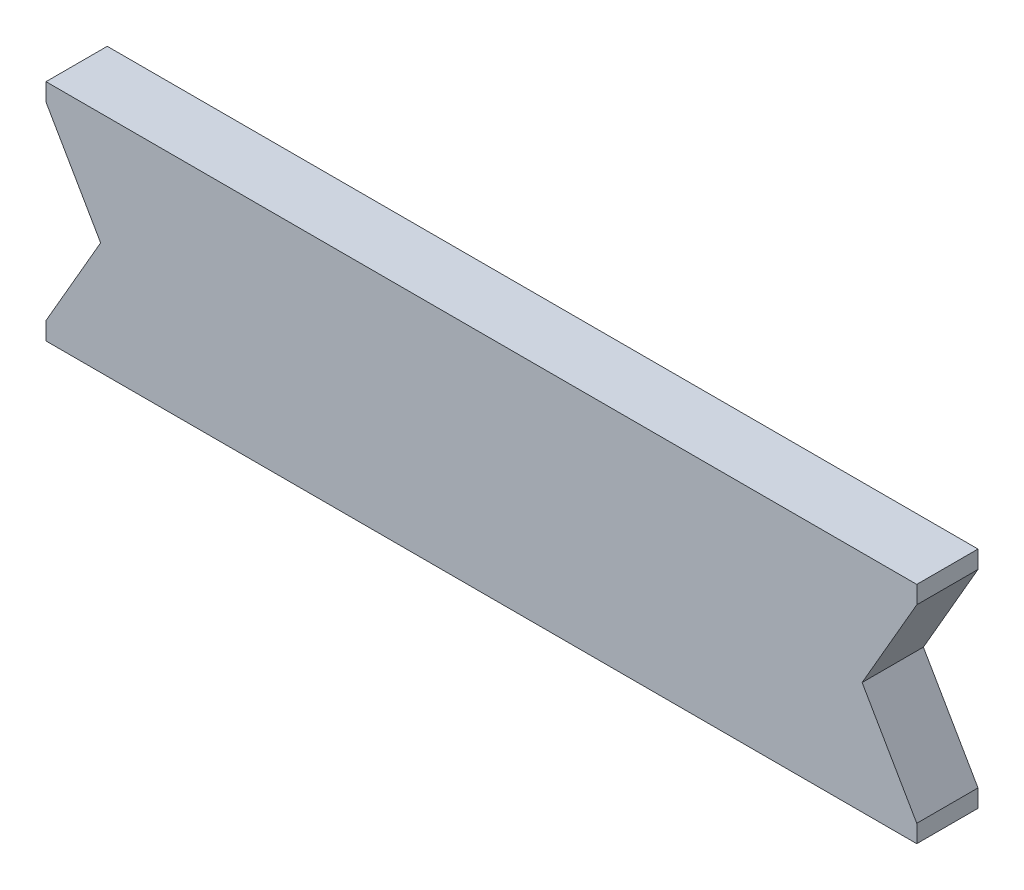
ISO-10303-21;
HEADER;
FILE_DESCRIPTION(('STEP AP214'),'2;1');
FILE_NAME('part.step','',(''),(''),'','','');
FILE_SCHEMA(('AUTOMOTIVE_DESIGN { 1 0 10303 214 1 1 1 1 }'));
ENDSEC;
DATA;
#1=APPLICATION_CONTEXT('core data for automotive mechanical design processes');
#2=APPLICATION_PROTOCOL_DEFINITION('international standard','automotive_design',2000,#1);
#3=PRODUCT_CONTEXT('',#1,'mechanical');
#4=PRODUCT('Part','Part','',(#3));
#5=PRODUCT_RELATED_PRODUCT_CATEGORY('part','',(#4));
#6=PRODUCT_DEFINITION_FORMATION('','',#4);
#7=PRODUCT_DEFINITION_CONTEXT('part definition',#1,'design');
#8=PRODUCT_DEFINITION('design','',#6,#7);
#9=PRODUCT_DEFINITION_SHAPE('','',#8);
#10=(LENGTH_UNIT() NAMED_UNIT(*) SI_UNIT(.MILLI.,.METRE.));
#11=(NAMED_UNIT(*) PLANE_ANGLE_UNIT() SI_UNIT($,.RADIAN.));
#12=(NAMED_UNIT(*) SI_UNIT($,.STERADIAN.) SOLID_ANGLE_UNIT());
#13=UNCERTAINTY_MEASURE_WITH_UNIT(LENGTH_MEASURE(1.E-05),#10,'distance_accuracy_value','');
#14=(GEOMETRIC_REPRESENTATION_CONTEXT(3) GLOBAL_UNCERTAINTY_ASSIGNED_CONTEXT((#13)) GLOBAL_UNIT_ASSIGNED_CONTEXT((#10,
#11,#12)) REPRESENTATION_CONTEXT('',''));
#15=CARTESIAN_POINT('',(0.,0.,0.));
#16=DIRECTION('',(0.,0.,1.));
#17=DIRECTION('',(1.,0.,0.));
#18=AXIS2_PLACEMENT_3D('',#15,#16,#17);
#19=CARTESIAN_POINT('',(10.9122867597285,2.75,1.5));
#20=DIRECTION('',(0.,-1.,0.));
#21=DIRECTION('',(0.,0.,-1.));
#22=AXIS2_PLACEMENT_3D('',#19,#20,#21);
#23=PLANE('',#22);
#24=DIRECTION('',(-1.,0.,0.));
#25=VECTOR('',#24,1.);
#26=CARTESIAN_POINT('',(10.9122867597285,2.75,0.));
#27=LINE('',#26,#25);
#28=CARTESIAN_POINT('',(10.6622867597285,2.75,0.));
#29=VERTEX_POINT('',#28);
#30=CARTESIAN_POINT('',(-10.6622867597285,2.75,0.));
#31=VERTEX_POINT('',#30);
#32=EDGE_CURVE('E156',#29,#31,#27,.T.);
#33=ORIENTED_EDGE('',*,*,#32,.T.);
#34=DIRECTION('',(0.,0.,1.));
#35=VECTOR('',#34,1.);
#36=CARTESIAN_POINT('',(-10.6622867597285,2.75,0.));
#37=LINE('',#36,#35);
#38=CARTESIAN_POINT('',(-10.6622867597285,2.75,1.5));
#39=VERTEX_POINT('',#38);
#40=EDGE_CURVE('E54',#31,#39,#37,.T.);
#41=ORIENTED_EDGE('',*,*,#40,.T.);
#42=DIRECTION('',(-1.,0.,0.));
#43=VECTOR('',#42,1.);
#44=CARTESIAN_POINT('',(10.9122867597285,2.75,1.5));
#45=LINE('',#44,#43);
#46=CARTESIAN_POINT('',(10.6622867597285,2.75,1.5));
#47=VERTEX_POINT('',#46);
#48=EDGE_CURVE('E137',#47,#39,#45,.T.);
#49=ORIENTED_EDGE('',*,*,#48,.F.);
#50=DIRECTION('',(0.,0.,1.));
#51=VECTOR('',#50,1.);
#52=CARTESIAN_POINT('',(10.6622867597285,2.75,0.));
#53=LINE('',#52,#51);
#54=EDGE_CURVE('E176',#29,#47,#53,.T.);
#55=ORIENTED_EDGE('',*,*,#54,.F.);
#56=EDGE_LOOP('',(#33,#41,#49,#55));
#57=FACE_BOUND('',#56,.T.);
#58=ADVANCED_FACE('F32',(#57),#23,.F.);
#59=CARTESIAN_POINT('',(-10.9122867597285,2.75,1.5));
#60=DIRECTION('',(0.866025403784439,0.5,0.));
#61=DIRECTION('',(-0.5,0.866025403784439,0.));
#62=AXIS2_PLACEMENT_3D('',#59,#60,#61);
#63=PLANE('',#62);
#64=DIRECTION('',(0.5,-0.866025403784439,0.));
#65=VECTOR('',#64,1.);
#66=CARTESIAN_POINT('',(-10.9122867597285,2.75,1.5));
#67=LINE('',#66,#65);
#68=CARTESIAN_POINT('',(-10.6622867597285,2.31698729810778,1.5));
#69=VERTEX_POINT('',#68);
#70=CARTESIAN_POINT('',(-9.32457351945707,0.,1.5));
#71=VERTEX_POINT('',#70);
#72=EDGE_CURVE('E166',#69,#71,#67,.T.);
#73=ORIENTED_EDGE('',*,*,#72,.F.);
#74=DIRECTION('',(0.,0.,-1.));
#75=VECTOR('',#74,1.);
#76=CARTESIAN_POINT('',(-10.6622867597285,2.31698729810778,1.5));
#77=LINE('',#76,#75);
#78=CARTESIAN_POINT('',(-10.6622867597285,2.31698729810778,0.));
#79=VERTEX_POINT('',#78);
#80=EDGE_CURVE('E185',#69,#79,#77,.T.);
#81=ORIENTED_EDGE('',*,*,#80,.T.);
#82=DIRECTION('',(0.5,-0.866025403784439,0.));
#83=VECTOR('',#82,1.);
#84=CARTESIAN_POINT('',(-10.9122867597285,2.75,0.));
#85=LINE('',#84,#83);
#86=CARTESIAN_POINT('',(-9.32457351945707,0.,0.));
#87=VERTEX_POINT('',#86);
#88=EDGE_CURVE('E131',#79,#87,#85,.T.);
#89=ORIENTED_EDGE('',*,*,#88,.T.);
#90=DIRECTION('',(0.,0.,-1.));
#91=VECTOR('',#90,1.);
#92=CARTESIAN_POINT('',(-9.32457351945707,0.,1.5));
#93=LINE('',#92,#91);
#94=EDGE_CURVE('E141',#71,#87,#93,.T.);
#95=ORIENTED_EDGE('',*,*,#94,.F.);
#96=EDGE_LOOP('',(#73,#81,#89,#95));
#97=FACE_BOUND('',#96,.T.);
#98=ADVANCED_FACE('F212',(#97),#63,.F.);
#99=CARTESIAN_POINT('',(-9.32457351945707,0.,1.5));
#100=DIRECTION('',(0.866025403784439,-0.5,0.));
#101=DIRECTION('',(0.5,0.866025403784439,0.));
#102=AXIS2_PLACEMENT_3D('',#99,#100,#101);
#103=PLANE('',#102);
#104=DIRECTION('',(-0.5,-0.866025403784439,0.));
#105=VECTOR('',#104,1.);
#106=CARTESIAN_POINT('',(-9.32457351945707,0.,0.));
#107=LINE('',#106,#105);
#108=CARTESIAN_POINT('',(-10.6622867597285,-2.31698729810777,0.));
#109=VERTEX_POINT('',#108);
#110=EDGE_CURVE('E127',#87,#109,#107,.T.);
#111=ORIENTED_EDGE('',*,*,#110,.T.);
#112=DIRECTION('',(0.,0.,1.));
#113=VECTOR('',#112,1.);
#114=CARTESIAN_POINT('',(-10.6622867597285,-2.31698729810777,1.5));
#115=LINE('',#114,#113);
#116=CARTESIAN_POINT('',(-10.6622867597285,-2.31698729810777,1.5));
#117=VERTEX_POINT('',#116);
#118=EDGE_CURVE('E46',#109,#117,#115,.T.);
#119=ORIENTED_EDGE('',*,*,#118,.T.);
#120=DIRECTION('',(-0.5,-0.866025403784439,0.));
#121=VECTOR('',#120,1.);
#122=CARTESIAN_POINT('',(-9.32457351945707,0.,1.5));
#123=LINE('',#122,#121);
#124=EDGE_CURVE('E149',#71,#117,#123,.T.);
#125=ORIENTED_EDGE('',*,*,#124,.F.);
#126=ORIENTED_EDGE('',*,*,#94,.T.);
#127=EDGE_LOOP('',(#111,#119,#125,#126));
#128=FACE_BOUND('',#127,.T.);
#129=ADVANCED_FACE('F147',(#128),#103,.F.);
#130=CARTESIAN_POINT('',(-10.9122867597285,-2.74999999999999,1.5));
#131=DIRECTION('',(0.,1.,0.));
#132=DIRECTION('',(0.,0.,1.));
#133=AXIS2_PLACEMENT_3D('',#130,#131,#132);
#134=PLANE('',#133);
#135=DIRECTION('',(1.,0.,0.));
#136=VECTOR('',#135,1.);
#137=CARTESIAN_POINT('',(-10.9122867597285,-2.74999999999999,1.5));
#138=LINE('',#137,#136);
#139=CARTESIAN_POINT('',(-10.6622867597285,-2.74999999999999,1.5));
#140=VERTEX_POINT('',#139);
#141=CARTESIAN_POINT('',(10.6622867597285,-2.74999999999999,1.5));
#142=VERTEX_POINT('',#141);
#143=EDGE_CURVE('E121',#140,#142,#138,.T.);
#144=ORIENTED_EDGE('',*,*,#143,.F.);
#145=DIRECTION('',(0.,0.,1.));
#146=VECTOR('',#145,1.);
#147=CARTESIAN_POINT('',(-10.6622867597285,-2.74999999999999,0.));
#148=LINE('',#147,#146);
#149=CARTESIAN_POINT('',(-10.6622867597285,-2.74999999999999,0.));
#150=VERTEX_POINT('',#149);
#151=EDGE_CURVE('E107',#150,#140,#148,.T.);
#152=ORIENTED_EDGE('',*,*,#151,.F.);
#153=DIRECTION('',(1.,0.,0.));
#154=VECTOR('',#153,1.);
#155=CARTESIAN_POINT('',(-10.9122867597285,-2.74999999999999,0.));
#156=LINE('',#155,#154);
#157=CARTESIAN_POINT('',(10.6622867597285,-2.74999999999999,0.));
#158=VERTEX_POINT('',#157);
#159=EDGE_CURVE('E119',#150,#158,#156,.T.);
#160=ORIENTED_EDGE('',*,*,#159,.T.);
#161=DIRECTION('',(0.,0.,1.));
#162=VECTOR('',#161,1.);
#163=CARTESIAN_POINT('',(10.6622867597285,-2.74999999999999,0.));
#164=LINE('',#163,#162);
#165=EDGE_CURVE('E175',#158,#142,#164,.T.);
#166=ORIENTED_EDGE('',*,*,#165,.T.);
#167=EDGE_LOOP('',(#144,#152,#160,#166));
#168=FACE_BOUND('',#167,.T.);
#169=ADVANCED_FACE('F117',(#168),#134,.F.);
#170=CARTESIAN_POINT('',(10.9122867597285,-2.74999999999999,1.5));
#171=DIRECTION('',(-0.866025403784439,-0.5,0.));
#172=DIRECTION('',(0.5,-0.866025403784439,0.));
#173=AXIS2_PLACEMENT_3D('',#170,#171,#172);
#174=PLANE('',#173);
#175=DIRECTION('',(-0.5,0.866025403784439,0.));
#176=VECTOR('',#175,1.);
#177=CARTESIAN_POINT('',(10.9122867597285,-2.74999999999999,1.5));
#178=LINE('',#177,#176);
#179=CARTESIAN_POINT('',(10.6622867597285,-2.31698729810777,1.5));
#180=VERTEX_POINT('',#179);
#181=CARTESIAN_POINT('',(9.32457351945707,0.,1.5));
#182=VERTEX_POINT('',#181);
#183=EDGE_CURVE('E162',#180,#182,#178,.T.);
#184=ORIENTED_EDGE('',*,*,#183,.F.);
#185=DIRECTION('',(0.,0.,-1.));
#186=VECTOR('',#185,1.);
#187=CARTESIAN_POINT('',(10.6622867597285,-2.31698729810777,1.5));
#188=LINE('',#187,#186);
#189=CARTESIAN_POINT('',(10.6622867597285,-2.31698729810777,0.));
#190=VERTEX_POINT('',#189);
#191=EDGE_CURVE('E157',#180,#190,#188,.T.);
#192=ORIENTED_EDGE('',*,*,#191,.T.);
#193=DIRECTION('',(-0.5,0.866025403784439,0.));
#194=VECTOR('',#193,1.);
#195=CARTESIAN_POINT('',(10.9122867597285,-2.74999999999999,0.));
#196=LINE('',#195,#194);
#197=CARTESIAN_POINT('',(9.32457351945707,0.,0.));
#198=VERTEX_POINT('',#197);
#199=EDGE_CURVE('E126',#190,#198,#196,.T.);
#200=ORIENTED_EDGE('',*,*,#199,.T.);
#201=DIRECTION('',(0.,0.,-1.));
#202=VECTOR('',#201,1.);
#203=CARTESIAN_POINT('',(9.32457351945707,0.,1.5));
#204=LINE('',#203,#202);
#205=EDGE_CURVE('E138',#182,#198,#204,.T.);
#206=ORIENTED_EDGE('',*,*,#205,.F.);
#207=EDGE_LOOP('',(#184,#192,#200,#206));
#208=FACE_BOUND('',#207,.T.);
#209=ADVANCED_FACE('F207',(#208),#174,.F.);
#210=CARTESIAN_POINT('',(9.32457351945707,0.,1.5));
#211=DIRECTION('',(-0.866025403784439,0.5,0.));
#212=DIRECTION('',(-0.5,-0.866025403784439,0.));
#213=AXIS2_PLACEMENT_3D('',#210,#211,#212);
#214=PLANE('',#213);
#215=DIRECTION('',(0.5,0.866025403784439,0.));
#216=VECTOR('',#215,1.);
#217=CARTESIAN_POINT('',(9.32457351945707,0.,0.));
#218=LINE('',#217,#216);
#219=CARTESIAN_POINT('',(10.6622867597285,2.31698729810778,0.));
#220=VERTEX_POINT('',#219);
#221=EDGE_CURVE('E129',#198,#220,#218,.T.);
#222=ORIENTED_EDGE('',*,*,#221,.T.);
#223=DIRECTION('',(0.,0.,1.));
#224=VECTOR('',#223,1.);
#225=CARTESIAN_POINT('',(10.6622867597285,2.31698729810778,1.5));
#226=LINE('',#225,#224);
#227=CARTESIAN_POINT('',(10.6622867597285,2.31698729810778,1.5));
#228=VERTEX_POINT('',#227);
#229=EDGE_CURVE('E172',#220,#228,#226,.T.);
#230=ORIENTED_EDGE('',*,*,#229,.T.);
#231=DIRECTION('',(0.5,0.866025403784439,0.));
#232=VECTOR('',#231,1.);
#233=CARTESIAN_POINT('',(9.32457351945707,0.,1.5));
#234=LINE('',#233,#232);
#235=EDGE_CURVE('E142',#182,#228,#234,.T.);
#236=ORIENTED_EDGE('',*,*,#235,.F.);
#237=ORIENTED_EDGE('',*,*,#205,.T.);
#238=EDGE_LOOP('',(#222,#230,#236,#237));
#239=FACE_BOUND('',#238,.T.);
#240=ADVANCED_FACE('F202',(#239),#214,.F.);
#241=CARTESIAN_POINT('',(0.,0.,1.5));
#242=DIRECTION('',(0.,0.,1.));
#243=DIRECTION('',(1.,0.,0.));
#244=AXIS2_PLACEMENT_3D('',#241,#242,#243);
#245=PLANE('',#244);
#246=DIRECTION('',(0.,1.,0.));
#247=VECTOR('',#246,1.);
#248=CARTESIAN_POINT('',(-10.6622867597285,2.75,1.5));
#249=LINE('',#248,#247);
#250=EDGE_CURVE('E113',#140,#117,#249,.T.);
#251=ORIENTED_EDGE('',*,*,#250,.F.);
#252=ORIENTED_EDGE('',*,*,#143,.T.);
#253=DIRECTION('',(0.,-1.,0.));
#254=VECTOR('',#253,1.);
#255=CARTESIAN_POINT('',(10.6622867597285,2.75,1.5));
#256=LINE('',#255,#254);
#257=EDGE_CURVE('E182',#180,#142,#256,.T.);
#258=ORIENTED_EDGE('',*,*,#257,.F.);
#259=ORIENTED_EDGE('',*,*,#183,.T.);
#260=ORIENTED_EDGE('',*,*,#235,.T.);
#261=EDGE_CURVE('E180',#47,#228,#256,.T.);
#262=ORIENTED_EDGE('',*,*,#261,.F.);
#263=ORIENTED_EDGE('',*,*,#48,.T.);
#264=EDGE_CURVE('E189',#69,#39,#249,.T.);
#265=ORIENTED_EDGE('',*,*,#264,.F.);
#266=ORIENTED_EDGE('',*,*,#72,.T.);
#267=ORIENTED_EDGE('',*,*,#124,.T.);
#268=EDGE_LOOP('',(#251,#252,#258,#259,#260,#262,#263,#265,#266,#267));
#269=FACE_BOUND('',#268,.T.);
#270=ADVANCED_FACE('F197',(#269),#245,.T.);
#271=CARTESIAN_POINT('',(0.,0.,0.));
#272=DIRECTION('',(0.,0.,1.));
#273=DIRECTION('',(1.,0.,0.));
#274=AXIS2_PLACEMENT_3D('',#271,#272,#273);
#275=PLANE('',#274);
#276=ORIENTED_EDGE('',*,*,#159,.F.);
#277=DIRECTION('',(0.,1.,0.));
#278=VECTOR('',#277,1.);
#279=CARTESIAN_POINT('',(-10.6622867597285,2.75,0.));
#280=LINE('',#279,#278);
#281=EDGE_CURVE('E104',#150,#109,#280,.T.);
#282=ORIENTED_EDGE('',*,*,#281,.T.);
#283=ORIENTED_EDGE('',*,*,#110,.F.);
#284=ORIENTED_EDGE('',*,*,#88,.F.);
#285=DIRECTION('',(0.,1.,0.));
#286=VECTOR('',#285,1.);
#287=CARTESIAN_POINT('',(-10.6622867597285,0.,0.));
#288=LINE('',#287,#286);
#289=EDGE_CURVE('E11',#79,#31,#288,.T.);
#290=ORIENTED_EDGE('',*,*,#289,.T.);
#291=ORIENTED_EDGE('',*,*,#32,.F.);
#292=DIRECTION('',(0.,-1.,0.));
#293=VECTOR('',#292,1.);
#294=CARTESIAN_POINT('',(10.6622867597285,2.75,0.));
#295=LINE('',#294,#293);
#296=EDGE_CURVE('E178',#29,#220,#295,.T.);
#297=ORIENTED_EDGE('',*,*,#296,.T.);
#298=ORIENTED_EDGE('',*,*,#221,.F.);
#299=ORIENTED_EDGE('',*,*,#199,.F.);
#300=DIRECTION('',(0.,-1.,0.));
#301=VECTOR('',#300,1.);
#302=CARTESIAN_POINT('',(10.6622867597285,0.,0.));
#303=LINE('',#302,#301);
#304=EDGE_CURVE('E39',#190,#158,#303,.T.);
#305=ORIENTED_EDGE('',*,*,#304,.T.);
#306=EDGE_LOOP('',(#276,#282,#283,#284,#290,#291,#297,#298,#299,#305));
#307=FACE_BOUND('',#306,.T.);
#308=ADVANCED_FACE('F124',(#307),#275,.F.);
#309=CARTESIAN_POINT('',(10.6622867597285,2.75,0.));
#310=DIRECTION('',(-1.,0.,0.));
#311=DIRECTION('',(0.,0.,1.));
#312=AXIS2_PLACEMENT_3D('',#309,#310,#311);
#313=PLANE('',#312);
#314=ORIENTED_EDGE('',*,*,#257,.T.);
#315=ORIENTED_EDGE('',*,*,#165,.F.);
#316=ORIENTED_EDGE('',*,*,#304,.F.);
#317=ORIENTED_EDGE('',*,*,#191,.F.);
#318=EDGE_LOOP('',(#314,#315,#316,#317));
#319=FACE_BOUND('',#318,.T.);
#320=ADVANCED_FACE('F211',(#319),#313,.F.);
#321=ORIENTED_EDGE('',*,*,#296,.F.);
#322=ORIENTED_EDGE('',*,*,#54,.T.);
#323=ORIENTED_EDGE('',*,*,#261,.T.);
#324=ORIENTED_EDGE('',*,*,#229,.F.);
#325=EDGE_LOOP('',(#321,#322,#323,#324));
#326=FACE_BOUND('',#325,.T.);
#327=ADVANCED_FACE('F200',(#326),#313,.F.);
#328=CARTESIAN_POINT('',(-10.6622867597285,2.75,0.));
#329=DIRECTION('',(1.,0.,0.));
#330=DIRECTION('',(0.,0.,-1.));
#331=AXIS2_PLACEMENT_3D('',#328,#329,#330);
#332=PLANE('',#331);
#333=ORIENTED_EDGE('',*,*,#264,.T.);
#334=ORIENTED_EDGE('',*,*,#40,.F.);
#335=ORIENTED_EDGE('',*,*,#289,.F.);
#336=ORIENTED_EDGE('',*,*,#80,.F.);
#337=EDGE_LOOP('',(#333,#334,#335,#336));
#338=FACE_BOUND('',#337,.T.);
#339=ADVANCED_FACE('F191',(#338),#332,.F.);
#340=ORIENTED_EDGE('',*,*,#281,.F.);
#341=ORIENTED_EDGE('',*,*,#151,.T.);
#342=ORIENTED_EDGE('',*,*,#250,.T.);
#343=ORIENTED_EDGE('',*,*,#118,.F.);
#344=EDGE_LOOP('',(#340,#341,#342,#343));
#345=FACE_BOUND('',#344,.T.);
#346=ADVANCED_FACE('F106',(#345),#332,.F.);
#347=CLOSED_SHELL('',(#58,#98,#129,#169,#209,#240,#270,#308,#320,#327,#339,#346));
#348=MANIFOLD_SOLID_BREP('B2',#347);
#349=ADVANCED_BREP_SHAPE_REPRESENTATION('',(#18,#348),#14);
#350=SHAPE_DEFINITION_REPRESENTATION(#9,#349);
ENDSEC;
END-ISO-10303-21;
